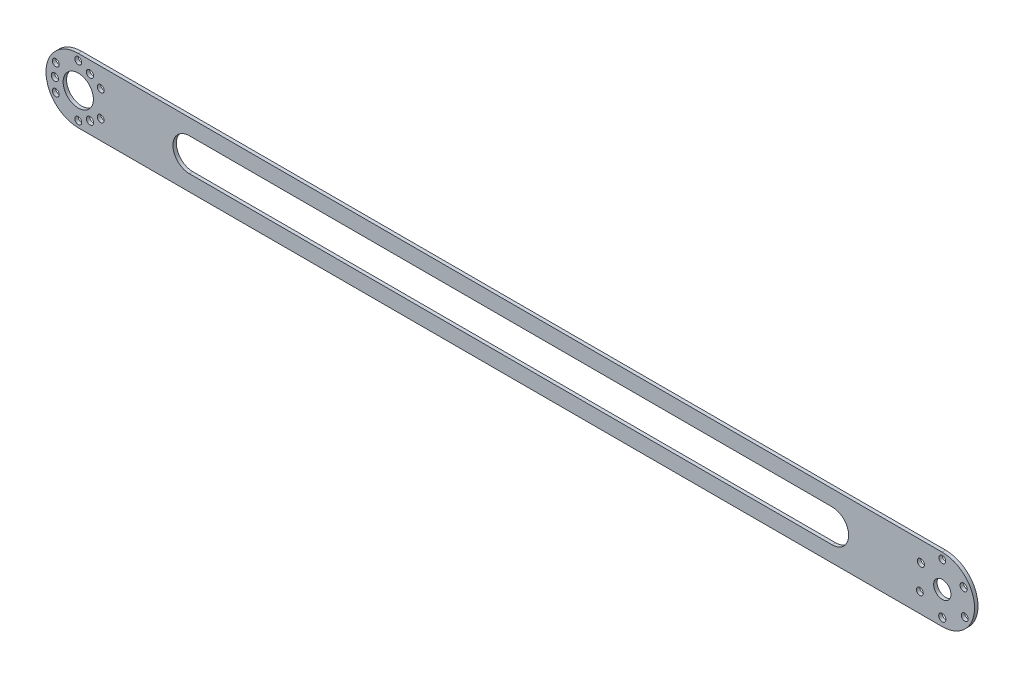
ISO-10303-21;
HEADER;
FILE_DESCRIPTION(('STEP AP214'),'2;1');
FILE_NAME('part.step','',(''),(''),'','','');
FILE_SCHEMA(('AUTOMOTIVE_DESIGN { 1 0 10303 214 1 1 1 1 }'));
ENDSEC;
DATA;
#1=APPLICATION_CONTEXT('core data for automotive mechanical design processes');
#2=APPLICATION_PROTOCOL_DEFINITION('international standard','automotive_design',2000,#1);
#3=PRODUCT_CONTEXT('',#1,'mechanical');
#4=PRODUCT('Part','Part','',(#3));
#5=PRODUCT_RELATED_PRODUCT_CATEGORY('part','',(#4));
#6=PRODUCT_DEFINITION_FORMATION('','',#4);
#7=PRODUCT_DEFINITION_CONTEXT('part definition',#1,'design');
#8=PRODUCT_DEFINITION('design','',#6,#7);
#9=PRODUCT_DEFINITION_SHAPE('','',#8);
#10=(LENGTH_UNIT() NAMED_UNIT(*) SI_UNIT(.MILLI.,.METRE.));
#11=(NAMED_UNIT(*) PLANE_ANGLE_UNIT() SI_UNIT($,.RADIAN.));
#12=(NAMED_UNIT(*) SI_UNIT($,.STERADIAN.) SOLID_ANGLE_UNIT());
#13=UNCERTAINTY_MEASURE_WITH_UNIT(LENGTH_MEASURE(1.E-05),#10,'distance_accuracy_value','');
#14=(GEOMETRIC_REPRESENTATION_CONTEXT(3) GLOBAL_UNCERTAINTY_ASSIGNED_CONTEXT((#13)) GLOBAL_UNIT_ASSIGNED_CONTEXT((#10,
#11,#12)) REPRESENTATION_CONTEXT('',''));
#15=CARTESIAN_POINT('',(0.,0.,0.));
#16=DIRECTION('',(0.,0.,1.));
#17=DIRECTION('',(1.,0.,0.));
#18=AXIS2_PLACEMENT_3D('',#15,#16,#17);
#19=CARTESIAN_POINT('',(341.797136251353,-84.9071474013098,2.));
#20=DIRECTION('',(0.,0.,-1.));
#21=DIRECTION('',(-1.,0.,0.));
#22=AXIS2_PLACEMENT_3D('',#19,#20,#21);
#23=PLANE('',#22);
#24=CARTESIAN_POINT('',(-150.85500660579,-96.6244711145133,2.));
#25=DIRECTION('',(0.,0.,1.));
#26=DIRECTION('',(1.,0.,0.));
#27=AXIS2_PLACEMENT_3D('',#24,#25,#26);
#28=CIRCLE('',#27,2.08);
#29=CARTESIAN_POINT('',(-148.77500660579,-96.6244711145133,2.));
#30=VERTEX_POINT('',#29);
#31=EDGE_CURVE('E153',#30,#30,#28,.T.);
#32=ORIENTED_EDGE('',*,*,#31,.F.);
#33=EDGE_LOOP('',(#32));
#34=FACE_BOUND('',#33,.T.);
#35=CARTESIAN_POINT('',(-150.85500660579,-73.1898236881064,2.));
#36=DIRECTION('',(0.,0.,1.));
#37=DIRECTION('',(1.,0.,0.));
#38=AXIS2_PLACEMENT_3D('',#35,#36,#37);
#39=CIRCLE('',#38,2.08000000000001);
#40=CARTESIAN_POINT('',(-148.77500660579,-73.1898236881064,2.));
#41=VERTEX_POINT('',#40);
#42=EDGE_CURVE('E161',#41,#41,#39,.T.);
#43=ORIENTED_EDGE('',*,*,#42,.F.);
#44=EDGE_LOOP('',(#43));
#45=FACE_BOUND('',#44,.T.);
#46=CARTESIAN_POINT('',(-157.62000660579,-84.9071474013098,2.));
#47=DIRECTION('',(0.,0.,1.));
#48=DIRECTION('',(1.,0.,0.));
#49=AXIS2_PLACEMENT_3D('',#46,#47,#48);
#50=CIRCLE('',#49,8.75);
#51=CARTESIAN_POINT('',(-148.87000660579,-84.9071474013098,2.));
#52=VERTEX_POINT('',#51);
#53=EDGE_CURVE('E169',#52,#52,#50,.T.);
#54=ORIENTED_EDGE('',*,*,#53,.F.);
#55=EDGE_LOOP('',(#54));
#56=FACE_BOUND('',#55,.T.);
#57=CARTESIAN_POINT('',(-144.629625549024,-92.40714740131,2.));
#58=DIRECTION('',(0.,0.,1.));
#59=DIRECTION('',(1.,0.,0.));
#60=AXIS2_PLACEMENT_3D('',#57,#58,#59);
#61=CIRCLE('',#60,1.99999999999999);
#62=CARTESIAN_POINT('',(-142.629625549024,-92.40714740131,2.));
#63=VERTEX_POINT('',#62);
#64=EDGE_CURVE('E177',#63,#63,#61,.T.);
#65=ORIENTED_EDGE('',*,*,#64,.F.);
#66=EDGE_LOOP('',(#65));
#67=FACE_BOUND('',#66,.T.);
#68=CARTESIAN_POINT('',(-144.629625549023,-77.40714740131,2.));
#69=DIRECTION('',(0.,0.,1.));
#70=DIRECTION('',(1.,0.,0.));
#71=AXIS2_PLACEMENT_3D('',#68,#69,#70);
#72=CIRCLE('',#71,1.99999999999999);
#73=CARTESIAN_POINT('',(-142.629625549024,-77.40714740131,2.));
#74=VERTEX_POINT('',#73);
#75=EDGE_CURVE('E185',#74,#74,#72,.T.);
#76=ORIENTED_EDGE('',*,*,#75,.F.);
#77=EDGE_LOOP('',(#76));
#78=FACE_BOUND('',#77,.T.);
#79=CARTESIAN_POINT('',(-157.62000660579,-69.9071474013098,2.));
#80=DIRECTION('',(0.,0.,1.));
#81=DIRECTION('',(1.,0.,0.));
#82=AXIS2_PLACEMENT_3D('',#79,#80,#81);
#83=CIRCLE('',#82,1.99999999999999);
#84=CARTESIAN_POINT('',(-155.62000660579,-69.9071474013098,2.));
#85=VERTEX_POINT('',#84);
#86=EDGE_CURVE('E193',#85,#85,#83,.T.);
#87=ORIENTED_EDGE('',*,*,#86,.F.);
#88=EDGE_LOOP('',(#87));
#89=FACE_BOUND('',#88,.T.);
#90=CARTESIAN_POINT('',(-170.610387662557,-77.4071474013098,2.));
#91=DIRECTION('',(0.,0.,1.));
#92=DIRECTION('',(1.,0.,0.));
#93=AXIS2_PLACEMENT_3D('',#90,#91,#92);
#94=CIRCLE('',#93,2.00000000000001);
#95=CARTESIAN_POINT('',(-168.610387662557,-77.4071474013098,2.));
#96=VERTEX_POINT('',#95);
#97=EDGE_CURVE('E201',#96,#96,#94,.T.);
#98=ORIENTED_EDGE('',*,*,#97,.F.);
#99=EDGE_LOOP('',(#98));
#100=FACE_BOUND('',#99,.T.);
#101=CARTESIAN_POINT('',(-170.610387662557,-92.4071474013098,2.));
#102=DIRECTION('',(0.,0.,1.));
#103=DIRECTION('',(1.,0.,0.));
#104=AXIS2_PLACEMENT_3D('',#101,#102,#103);
#105=CIRCLE('',#104,2.00000000000001);
#106=CARTESIAN_POINT('',(-168.610387662557,-92.4071474013098,2.));
#107=VERTEX_POINT('',#106);
#108=EDGE_CURVE('E209',#107,#107,#105,.T.);
#109=ORIENTED_EDGE('',*,*,#108,.F.);
#110=EDGE_LOOP('',(#109));
#111=FACE_BOUND('',#110,.T.);
#112=CARTESIAN_POINT('',(-171.15000660579,-84.9071474013098,2.));
#113=DIRECTION('',(0.,0.,1.));
#114=DIRECTION('',(1.,0.,0.));
#115=AXIS2_PLACEMENT_3D('',#112,#113,#114);
#116=CIRCLE('',#115,2.08);
#117=CARTESIAN_POINT('',(-169.07000660579,-84.9071474013098,2.));
#118=VERTEX_POINT('',#117);
#119=EDGE_CURVE('E217',#118,#118,#116,.T.);
#120=ORIENTED_EDGE('',*,*,#119,.F.);
#121=EDGE_LOOP('',(#120));
#122=FACE_BOUND('',#121,.T.);
#123=CARTESIAN_POINT('',(-157.62000660579,-99.9071474013098,2.));
#124=DIRECTION('',(0.,0.,1.));
#125=DIRECTION('',(1.,0.,0.));
#126=AXIS2_PLACEMENT_3D('',#123,#124,#125);
#127=CIRCLE('',#126,2.);
#128=CARTESIAN_POINT('',(-155.62000660579,-99.9071474013098,2.));
#129=VERTEX_POINT('',#128);
#130=EDGE_CURVE('E225',#129,#129,#127,.T.);
#131=ORIENTED_EDGE('',*,*,#130,.F.);
#132=EDGE_LOOP('',(#131));
#133=FACE_BOUND('',#132,.T.);
#134=CARTESIAN_POINT('',(341.797136251355,-99.0365196042188,2.));
#135=DIRECTION('',(0.,0.,1.));
#136=DIRECTION('',(1.,0.,0.));
#137=AXIS2_PLACEMENT_3D('',#134,#135,#136);
#138=CIRCLE('',#137,2.08000000000043);
#139=CARTESIAN_POINT('',(343.877136251355,-99.0365196042188,2.));
#140=VERTEX_POINT('',#139);
#141=EDGE_CURVE('E233',#140,#140,#138,.T.);
#142=ORIENTED_EDGE('',*,*,#141,.F.);
#143=EDGE_LOOP('',(#142));
#144=FACE_BOUND('',#143,.T.);
#145=CARTESIAN_POINT('',(354.159723791721,-77.6238898712818,2.));
#146=DIRECTION('',(0.,0.,1.));
#147=DIRECTION('',(1.,0.,0.));
#148=AXIS2_PLACEMENT_3D('',#145,#146,#147);
#149=CIRCLE('',#148,2.08000000000107);
#150=CARTESIAN_POINT('',(356.239723791722,-77.6238898712818,2.));
#151=VERTEX_POINT('',#150);
#152=EDGE_CURVE('E241',#151,#151,#149,.T.);
#153=ORIENTED_EDGE('',*,*,#152,.F.);
#154=EDGE_LOOP('',(#153));
#155=FACE_BOUND('',#154,.T.);
#156=CARTESIAN_POINT('',(329.434548710984,-77.7696041569979,2.));
#157=DIRECTION('',(0.,0.,1.));
#158=DIRECTION('',(1.,0.,0.));
#159=AXIS2_PLACEMENT_3D('',#156,#157,#158);
#160=CIRCLE('',#159,2.07999999999938);
#161=CARTESIAN_POINT('',(331.514548710984,-77.7696041569979,2.));
#162=VERTEX_POINT('',#161);
#163=EDGE_CURVE('E249',#162,#162,#160,.T.);
#164=ORIENTED_EDGE('',*,*,#163,.F.);
#165=EDGE_LOOP('',(#164));
#166=FACE_BOUND('',#165,.T.);
#167=CARTESIAN_POINT('',(328.806755194587,-92.4071474013096,2.));
#168=DIRECTION('',(0.,0.,1.));
#169=DIRECTION('',(1.,0.,0.));
#170=AXIS2_PLACEMENT_3D('',#167,#168,#169);
#171=CIRCLE('',#170,2.0000000000004);
#172=CARTESIAN_POINT('',(330.806755194587,-92.4071474013096,2.));
#173=VERTEX_POINT('',#172);
#174=EDGE_CURVE('E257',#173,#173,#171,.T.);
#175=ORIENTED_EDGE('',*,*,#174,.F.);
#176=EDGE_LOOP('',(#175));
#177=FACE_BOUND('',#176,.T.);
#178=CARTESIAN_POINT('',(354.78751730812,-92.261433115595,2.));
#179=DIRECTION('',(0.,0.,1.));
#180=DIRECTION('',(1.,0.,0.));
#181=AXIS2_PLACEMENT_3D('',#178,#179,#180);
#182=CIRCLE('',#181,2.00000000000081);
#183=CARTESIAN_POINT('',(356.787517308121,-92.261433115595,2.));
#184=VERTEX_POINT('',#183);
#185=EDGE_CURVE('E265',#184,#184,#182,.T.);
#186=ORIENTED_EDGE('',*,*,#185,.F.);
#187=EDGE_LOOP('',(#186));
#188=FACE_BOUND('',#187,.T.);
#189=CARTESIAN_POINT('',(341.797136251353,-69.9071474013097,2.));
#190=DIRECTION('',(0.,0.,1.));
#191=DIRECTION('',(1.,0.,0.));
#192=AXIS2_PLACEMENT_3D('',#189,#190,#191);
#193=CIRCLE('',#192,2.);
#194=CARTESIAN_POINT('',(343.797136251353,-69.9071474013097,2.));
#195=VERTEX_POINT('',#194);
#196=EDGE_CURVE('E273',#195,#195,#193,.T.);
#197=ORIENTED_EDGE('',*,*,#196,.F.);
#198=EDGE_LOOP('',(#197));
#199=FACE_BOUND('',#198,.T.);
#200=CARTESIAN_POINT('',(341.797136251353,-84.9071474013098,2.));
#201=DIRECTION('',(0.,0.,1.));
#202=DIRECTION('',(1.,0.,0.));
#203=AXIS2_PLACEMENT_3D('',#200,#201,#202);
#204=CIRCLE('',#203,4.99999999999999);
#205=CARTESIAN_POINT('',(346.797136251353,-84.9071474013098,2.));
#206=VERTEX_POINT('',#205);
#207=EDGE_CURVE('E281',#206,#206,#204,.T.);
#208=ORIENTED_EDGE('',*,*,#207,.F.);
#209=EDGE_LOOP('',(#208));
#210=FACE_BOUND('',#209,.T.);
#211=CARTESIAN_POINT('',(341.797136251353,-84.9071474013098,2.));
#212=DIRECTION('',(0.,0.,1.));
#213=DIRECTION('',(-1.,0.,0.));
#214=AXIS2_PLACEMENT_3D('',#211,#212,#213);
#215=CIRCLE('',#214,18.6457142857142);
#216=CARTESIAN_POINT('',(341.797136251353,-103.552861687024,2.));
#217=VERTEX_POINT('',#216);
#218=CARTESIAN_POINT('',(341.797136251353,-66.2614331155955,2.));
#219=VERTEX_POINT('',#218);
#220=EDGE_CURVE('E289',#217,#219,#215,.T.);
#221=ORIENTED_EDGE('',*,*,#220,.T.);
#222=DIRECTION('',(-1.,0.,0.));
#223=VECTOR('',#222,1.);
#224=CARTESIAN_POINT('',(341.797136251353,-66.2614331155955,2.));
#225=LINE('',#224,#223);
#226=CARTESIAN_POINT('',(-157.62000660579,-66.2614331155956,2.));
#227=VERTEX_POINT('',#226);
#228=EDGE_CURVE('E293',#219,#227,#225,.T.);
#229=ORIENTED_EDGE('',*,*,#228,.T.);
#230=CARTESIAN_POINT('',(-157.62000660579,-84.9071474013098,2.));
#231=DIRECTION('',(0.,0.,1.));
#232=DIRECTION('',(-1.,0.,0.));
#233=AXIS2_PLACEMENT_3D('',#230,#231,#232);
#234=CIRCLE('',#233,18.6457142857142);
#235=CARTESIAN_POINT('',(-157.62000660579,-103.552861687024,2.));
#236=VERTEX_POINT('',#235);
#237=EDGE_CURVE('E297',#227,#236,#234,.T.);
#238=ORIENTED_EDGE('',*,*,#237,.T.);
#239=DIRECTION('',(1.,0.,0.));
#240=VECTOR('',#239,1.);
#241=CARTESIAN_POINT('',(-157.62000660579,-103.552861687024,2.));
#242=LINE('',#241,#240);
#243=EDGE_CURVE('E300',#236,#217,#242,.T.);
#244=ORIENTED_EDGE('',*,*,#243,.T.);
#245=EDGE_LOOP('',(#221,#229,#238,#244));
#246=FACE_BOUND('',#245,.T.);
#247=CARTESIAN_POINT('',(-93.4219624882659,-84.9071474013098,2.));
#248=DIRECTION('',(0.,0.,1.));
#249=DIRECTION('',(1.,0.,0.));
#250=AXIS2_PLACEMENT_3D('',#247,#248,#249);
#251=CIRCLE('',#250,9.48310201444286);
#252=CARTESIAN_POINT('',(-93.4219624882659,-75.424045386867,2.));
#253=VERTEX_POINT('',#252);
#254=CARTESIAN_POINT('',(-93.4219624882659,-94.3902494157527,2.));
#255=VERTEX_POINT('',#254);
#256=EDGE_CURVE('E105',#253,#255,#251,.T.);
#257=ORIENTED_EDGE('',*,*,#256,.F.);
#258=DIRECTION('',(-1.,0.,0.));
#259=VECTOR('',#258,1.);
#260=CARTESIAN_POINT('',(-93.4219624882659,-75.424045386867,2.));
#261=LINE('',#260,#259);
#262=CARTESIAN_POINT('',(278.181949276686,-75.424045386867,2.));
#263=VERTEX_POINT('',#262);
#264=EDGE_CURVE('E131',#263,#253,#261,.T.);
#265=ORIENTED_EDGE('',*,*,#264,.F.);
#266=CARTESIAN_POINT('',(278.181949276686,-84.9071474013098,2.));
#267=DIRECTION('',(0.,0.,1.));
#268=DIRECTION('',(1.,0.,0.));
#269=AXIS2_PLACEMENT_3D('',#266,#267,#268);
#270=CIRCLE('',#269,9.48310201444286);
#271=CARTESIAN_POINT('',(278.181949276686,-94.3902494157527,2.));
#272=VERTEX_POINT('',#271);
#273=EDGE_CURVE('E127',#272,#263,#270,.T.);
#274=ORIENTED_EDGE('',*,*,#273,.F.);
#275=DIRECTION('',(1.,0.,0.));
#276=VECTOR('',#275,1.);
#277=CARTESIAN_POINT('',(-93.4219624882659,-94.3902494157527,2.));
#278=LINE('',#277,#276);
#279=EDGE_CURVE('E114',#255,#272,#278,.T.);
#280=ORIENTED_EDGE('',*,*,#279,.F.);
#281=EDGE_LOOP('',(#257,#265,#274,#280));
#282=FACE_BOUND('',#281,.T.);
#283=ADVANCED_FACE('F39',(#34,#45,#56,#67,#78,#89,#100,#111,#122,#133,#144,#155,#166,#177,#188,
#199,#210,#246,#282),#23,.F.);
#284=CARTESIAN_POINT('',(341.797136251353,-84.9071474013098,0.));
#285=DIRECTION('',(0.,0.,-1.));
#286=DIRECTION('',(-1.,0.,0.));
#287=AXIS2_PLACEMENT_3D('',#284,#285,#286);
#288=PLANE('',#287);
#289=CARTESIAN_POINT('',(-150.85500660579,-73.1898236881064,0.));
#290=DIRECTION('',(0.,0.,1.));
#291=DIRECTION('',(1.,0.,0.));
#292=AXIS2_PLACEMENT_3D('',#289,#290,#291);
#293=CIRCLE('',#292,2.08000000000001);
#294=CARTESIAN_POINT('',(-148.77500660579,-73.1898236881064,0.));
#295=VERTEX_POINT('',#294);
#296=EDGE_CURVE('E157',#295,#295,#293,.T.);
#297=ORIENTED_EDGE('',*,*,#296,.T.);
#298=EDGE_LOOP('',(#297));
#299=FACE_BOUND('',#298,.T.);
#300=CARTESIAN_POINT('',(-144.629625549024,-92.40714740131,0.));
#301=DIRECTION('',(0.,0.,1.));
#302=DIRECTION('',(1.,0.,0.));
#303=AXIS2_PLACEMENT_3D('',#300,#301,#302);
#304=CIRCLE('',#303,1.99999999999999);
#305=CARTESIAN_POINT('',(-142.629625549024,-92.40714740131,0.));
#306=VERTEX_POINT('',#305);
#307=EDGE_CURVE('E173',#306,#306,#304,.T.);
#308=ORIENTED_EDGE('',*,*,#307,.T.);
#309=EDGE_LOOP('',(#308));
#310=FACE_BOUND('',#309,.T.);
#311=CARTESIAN_POINT('',(-157.62000660579,-69.9071474013098,0.));
#312=DIRECTION('',(0.,0.,1.));
#313=DIRECTION('',(1.,0.,0.));
#314=AXIS2_PLACEMENT_3D('',#311,#312,#313);
#315=CIRCLE('',#314,1.99999999999999);
#316=CARTESIAN_POINT('',(-155.62000660579,-69.9071474013098,0.));
#317=VERTEX_POINT('',#316);
#318=EDGE_CURVE('E189',#317,#317,#315,.T.);
#319=ORIENTED_EDGE('',*,*,#318,.T.);
#320=EDGE_LOOP('',(#319));
#321=FACE_BOUND('',#320,.T.);
#322=CARTESIAN_POINT('',(-170.610387662557,-92.4071474013098,0.));
#323=DIRECTION('',(0.,0.,1.));
#324=DIRECTION('',(1.,0.,0.));
#325=AXIS2_PLACEMENT_3D('',#322,#323,#324);
#326=CIRCLE('',#325,2.00000000000001);
#327=CARTESIAN_POINT('',(-168.610387662557,-92.4071474013098,0.));
#328=VERTEX_POINT('',#327);
#329=EDGE_CURVE('E205',#328,#328,#326,.T.);
#330=ORIENTED_EDGE('',*,*,#329,.T.);
#331=EDGE_LOOP('',(#330));
#332=FACE_BOUND('',#331,.T.);
#333=CARTESIAN_POINT('',(-157.62000660579,-99.9071474013098,0.));
#334=DIRECTION('',(0.,0.,1.));
#335=DIRECTION('',(1.,0.,0.));
#336=AXIS2_PLACEMENT_3D('',#333,#334,#335);
#337=CIRCLE('',#336,2.);
#338=CARTESIAN_POINT('',(-155.62000660579,-99.9071474013098,0.));
#339=VERTEX_POINT('',#338);
#340=EDGE_CURVE('E221',#339,#339,#337,.T.);
#341=ORIENTED_EDGE('',*,*,#340,.T.);
#342=EDGE_LOOP('',(#341));
#343=FACE_BOUND('',#342,.T.);
#344=CARTESIAN_POINT('',(354.159723791721,-77.6238898712818,0.));
#345=DIRECTION('',(0.,0.,1.));
#346=DIRECTION('',(1.,0.,0.));
#347=AXIS2_PLACEMENT_3D('',#344,#345,#346);
#348=CIRCLE('',#347,2.08000000000107);
#349=CARTESIAN_POINT('',(356.239723791722,-77.6238898712818,0.));
#350=VERTEX_POINT('',#349);
#351=EDGE_CURVE('E237',#350,#350,#348,.T.);
#352=ORIENTED_EDGE('',*,*,#351,.T.);
#353=EDGE_LOOP('',(#352));
#354=FACE_BOUND('',#353,.T.);
#355=CARTESIAN_POINT('',(328.806755194587,-92.4071474013096,0.));
#356=DIRECTION('',(0.,0.,1.));
#357=DIRECTION('',(1.,0.,0.));
#358=AXIS2_PLACEMENT_3D('',#355,#356,#357);
#359=CIRCLE('',#358,2.0000000000004);
#360=CARTESIAN_POINT('',(330.806755194587,-92.4071474013096,0.));
#361=VERTEX_POINT('',#360);
#362=EDGE_CURVE('E253',#361,#361,#359,.T.);
#363=ORIENTED_EDGE('',*,*,#362,.T.);
#364=EDGE_LOOP('',(#363));
#365=FACE_BOUND('',#364,.T.);
#366=CARTESIAN_POINT('',(341.797136251353,-69.9071474013097,0.));
#367=DIRECTION('',(0.,0.,1.));
#368=DIRECTION('',(1.,0.,0.));
#369=AXIS2_PLACEMENT_3D('',#366,#367,#368);
#370=CIRCLE('',#369,2.);
#371=CARTESIAN_POINT('',(343.797136251353,-69.9071474013097,0.));
#372=VERTEX_POINT('',#371);
#373=EDGE_CURVE('E269',#372,#372,#370,.T.);
#374=ORIENTED_EDGE('',*,*,#373,.T.);
#375=EDGE_LOOP('',(#374));
#376=FACE_BOUND('',#375,.T.);
#377=CARTESIAN_POINT('',(341.797136251353,-84.9071474013098,0.));
#378=DIRECTION('',(0.,0.,1.));
#379=DIRECTION('',(-1.,0.,0.));
#380=AXIS2_PLACEMENT_3D('',#377,#378,#379);
#381=CIRCLE('',#380,18.6457142857142);
#382=CARTESIAN_POINT('',(341.797136251353,-103.552861687024,0.));
#383=VERTEX_POINT('',#382);
#384=CARTESIAN_POINT('',(341.797136251353,-66.2614331155955,0.));
#385=VERTEX_POINT('',#384);
#386=EDGE_CURVE('E285',#383,#385,#381,.T.);
#387=ORIENTED_EDGE('',*,*,#386,.F.);
#388=DIRECTION('',(1.,0.,0.));
#389=VECTOR('',#388,1.);
#390=CARTESIAN_POINT('',(-157.62000660579,-103.552861687024,0.));
#391=LINE('',#390,#389);
#392=CARTESIAN_POINT('',(-157.62000660579,-103.552861687024,0.));
#393=VERTEX_POINT('',#392);
#394=EDGE_CURVE('E294',#393,#383,#391,.T.);
#395=ORIENTED_EDGE('',*,*,#394,.F.);
#396=CARTESIAN_POINT('',(-157.62000660579,-84.9071474013098,0.));
#397=DIRECTION('',(0.,0.,1.));
#398=DIRECTION('',(-1.,0.,0.));
#399=AXIS2_PLACEMENT_3D('',#396,#397,#398);
#400=CIRCLE('',#399,18.6457142857142);
#401=CARTESIAN_POINT('',(-157.62000660579,-66.2614331155956,0.));
#402=VERTEX_POINT('',#401);
#403=EDGE_CURVE('E310',#402,#393,#400,.T.);
#404=ORIENTED_EDGE('',*,*,#403,.F.);
#405=DIRECTION('',(-1.,0.,0.));
#406=VECTOR('',#405,1.);
#407=CARTESIAN_POINT('',(341.797136251353,-66.2614331155955,0.));
#408=LINE('',#407,#406);
#409=EDGE_CURVE('E307',#385,#402,#408,.T.);
#410=ORIENTED_EDGE('',*,*,#409,.F.);
#411=EDGE_LOOP('',(#387,#395,#404,#410));
#412=FACE_BOUND('',#411,.T.);
#413=CARTESIAN_POINT('',(341.797136251353,-84.9071474013098,0.));
#414=DIRECTION('',(0.,0.,1.));
#415=DIRECTION('',(1.,0.,0.));
#416=AXIS2_PLACEMENT_3D('',#413,#414,#415);
#417=CIRCLE('',#416,4.99999999999999);
#418=CARTESIAN_POINT('',(346.797136251353,-84.9071474013098,0.));
#419=VERTEX_POINT('',#418);
#420=EDGE_CURVE('E277',#419,#419,#417,.T.);
#421=ORIENTED_EDGE('',*,*,#420,.T.);
#422=EDGE_LOOP('',(#421));
#423=FACE_BOUND('',#422,.T.);
#424=CARTESIAN_POINT('',(354.78751730812,-92.261433115595,0.));
#425=DIRECTION('',(0.,0.,1.));
#426=DIRECTION('',(1.,0.,0.));
#427=AXIS2_PLACEMENT_3D('',#424,#425,#426);
#428=CIRCLE('',#427,2.00000000000081);
#429=CARTESIAN_POINT('',(356.787517308121,-92.261433115595,0.));
#430=VERTEX_POINT('',#429);
#431=EDGE_CURVE('E261',#430,#430,#428,.T.);
#432=ORIENTED_EDGE('',*,*,#431,.T.);
#433=EDGE_LOOP('',(#432));
#434=FACE_BOUND('',#433,.T.);
#435=CARTESIAN_POINT('',(329.434548710984,-77.7696041569979,0.));
#436=DIRECTION('',(0.,0.,1.));
#437=DIRECTION('',(1.,0.,0.));
#438=AXIS2_PLACEMENT_3D('',#435,#436,#437);
#439=CIRCLE('',#438,2.07999999999938);
#440=CARTESIAN_POINT('',(331.514548710984,-77.7696041569979,0.));
#441=VERTEX_POINT('',#440);
#442=EDGE_CURVE('E245',#441,#441,#439,.T.);
#443=ORIENTED_EDGE('',*,*,#442,.T.);
#444=EDGE_LOOP('',(#443));
#445=FACE_BOUND('',#444,.T.);
#446=CARTESIAN_POINT('',(341.797136251355,-99.0365196042188,0.));
#447=DIRECTION('',(0.,0.,1.));
#448=DIRECTION('',(1.,0.,0.));
#449=AXIS2_PLACEMENT_3D('',#446,#447,#448);
#450=CIRCLE('',#449,2.08000000000043);
#451=CARTESIAN_POINT('',(343.877136251355,-99.0365196042188,0.));
#452=VERTEX_POINT('',#451);
#453=EDGE_CURVE('E229',#452,#452,#450,.T.);
#454=ORIENTED_EDGE('',*,*,#453,.T.);
#455=EDGE_LOOP('',(#454));
#456=FACE_BOUND('',#455,.T.);
#457=CARTESIAN_POINT('',(-171.15000660579,-84.9071474013098,0.));
#458=DIRECTION('',(0.,0.,1.));
#459=DIRECTION('',(1.,0.,0.));
#460=AXIS2_PLACEMENT_3D('',#457,#458,#459);
#461=CIRCLE('',#460,2.08);
#462=CARTESIAN_POINT('',(-169.07000660579,-84.9071474013098,0.));
#463=VERTEX_POINT('',#462);
#464=EDGE_CURVE('E213',#463,#463,#461,.T.);
#465=ORIENTED_EDGE('',*,*,#464,.T.);
#466=EDGE_LOOP('',(#465));
#467=FACE_BOUND('',#466,.T.);
#468=CARTESIAN_POINT('',(-170.610387662557,-77.4071474013098,0.));
#469=DIRECTION('',(0.,0.,1.));
#470=DIRECTION('',(1.,0.,0.));
#471=AXIS2_PLACEMENT_3D('',#468,#469,#470);
#472=CIRCLE('',#471,2.00000000000001);
#473=CARTESIAN_POINT('',(-168.610387662557,-77.4071474013098,0.));
#474=VERTEX_POINT('',#473);
#475=EDGE_CURVE('E197',#474,#474,#472,.T.);
#476=ORIENTED_EDGE('',*,*,#475,.T.);
#477=EDGE_LOOP('',(#476));
#478=FACE_BOUND('',#477,.T.);
#479=CARTESIAN_POINT('',(-144.629625549023,-77.40714740131,0.));
#480=DIRECTION('',(0.,0.,1.));
#481=DIRECTION('',(1.,0.,0.));
#482=AXIS2_PLACEMENT_3D('',#479,#480,#481);
#483=CIRCLE('',#482,1.99999999999999);
#484=CARTESIAN_POINT('',(-142.629625549024,-77.40714740131,0.));
#485=VERTEX_POINT('',#484);
#486=EDGE_CURVE('E181',#485,#485,#483,.T.);
#487=ORIENTED_EDGE('',*,*,#486,.T.);
#488=EDGE_LOOP('',(#487));
#489=FACE_BOUND('',#488,.T.);
#490=CARTESIAN_POINT('',(-157.62000660579,-84.9071474013098,0.));
#491=DIRECTION('',(0.,0.,1.));
#492=DIRECTION('',(1.,0.,0.));
#493=AXIS2_PLACEMENT_3D('',#490,#491,#492);
#494=CIRCLE('',#493,8.75);
#495=CARTESIAN_POINT('',(-148.87000660579,-84.9071474013098,0.));
#496=VERTEX_POINT('',#495);
#497=EDGE_CURVE('E165',#496,#496,#494,.T.);
#498=ORIENTED_EDGE('',*,*,#497,.T.);
#499=EDGE_LOOP('',(#498));
#500=FACE_BOUND('',#499,.T.);
#501=CARTESIAN_POINT('',(-150.85500660579,-96.6244711145133,0.));
#502=DIRECTION('',(0.,0.,1.));
#503=DIRECTION('',(1.,0.,0.));
#504=AXIS2_PLACEMENT_3D('',#501,#502,#503);
#505=CIRCLE('',#504,2.08);
#506=CARTESIAN_POINT('',(-148.77500660579,-96.6244711145133,0.));
#507=VERTEX_POINT('',#506);
#508=EDGE_CURVE('E123',#507,#507,#505,.T.);
#509=ORIENTED_EDGE('',*,*,#508,.T.);
#510=EDGE_LOOP('',(#509));
#511=FACE_BOUND('',#510,.T.);
#512=DIRECTION('',(-1.,0.,0.));
#513=VECTOR('',#512,1.);
#514=CARTESIAN_POINT('',(-93.4219624882659,-75.424045386867,0.));
#515=LINE('',#514,#513);
#516=CARTESIAN_POINT('',(278.181949276686,-75.424045386867,0.));
#517=VERTEX_POINT('',#516);
#518=CARTESIAN_POINT('',(-93.4219624882659,-75.424045386867,0.));
#519=VERTEX_POINT('',#518);
#520=EDGE_CURVE('E115',#517,#519,#515,.T.);
#521=ORIENTED_EDGE('',*,*,#520,.T.);
#522=CARTESIAN_POINT('',(-93.4219624882659,-84.9071474013098,0.));
#523=DIRECTION('',(0.,0.,1.));
#524=DIRECTION('',(1.,0.,0.));
#525=AXIS2_PLACEMENT_3D('',#522,#523,#524);
#526=CIRCLE('',#525,9.48310201444286);
#527=CARTESIAN_POINT('',(-93.4219624882659,-94.3902494157527,0.));
#528=VERTEX_POINT('',#527);
#529=EDGE_CURVE('E63',#519,#528,#526,.T.);
#530=ORIENTED_EDGE('',*,*,#529,.T.);
#531=DIRECTION('',(1.,0.,0.));
#532=VECTOR('',#531,1.);
#533=CARTESIAN_POINT('',(-93.4219624882659,-94.3902494157527,0.));
#534=LINE('',#533,#532);
#535=CARTESIAN_POINT('',(278.181949276686,-94.3902494157527,0.));
#536=VERTEX_POINT('',#535);
#537=EDGE_CURVE('E121',#528,#536,#534,.T.);
#538=ORIENTED_EDGE('',*,*,#537,.T.);
#539=CARTESIAN_POINT('',(278.181949276686,-84.9071474013098,0.));
#540=DIRECTION('',(0.,0.,1.));
#541=DIRECTION('',(1.,0.,0.));
#542=AXIS2_PLACEMENT_3D('',#539,#540,#541);
#543=CIRCLE('',#542,9.48310201444286);
#544=EDGE_CURVE('E140',#536,#517,#543,.T.);
#545=ORIENTED_EDGE('',*,*,#544,.T.);
#546=EDGE_LOOP('',(#521,#530,#538,#545));
#547=FACE_BOUND('',#546,.T.);
#548=ADVANCED_FACE('F333',(#299,#310,#321,#332,#343,#354,#365,#376,#412,#423,#434,#445,#456,
#467,#478,#489,#500,#511,#547),#288,.T.);
#549=CARTESIAN_POINT('',(341.797136251353,-84.9071474013098,2.));
#550=DIRECTION('',(0.,0.,-1.));
#551=DIRECTION('',(-1.,0.,0.));
#552=AXIS2_PLACEMENT_3D('',#549,#550,#551);
#553=CYLINDRICAL_SURFACE('',#552,18.6457142857142);
#554=ORIENTED_EDGE('',*,*,#386,.T.);
#555=DIRECTION('',(0.,0.,-1.));
#556=VECTOR('',#555,1.);
#557=CARTESIAN_POINT('',(341.797136251353,-66.2614331155955,2.));
#558=LINE('',#557,#556);
#559=EDGE_CURVE('E11',#219,#385,#558,.T.);
#560=ORIENTED_EDGE('',*,*,#559,.F.);
#561=ORIENTED_EDGE('',*,*,#220,.F.);
#562=DIRECTION('',(0.,0.,-1.));
#563=VECTOR('',#562,1.);
#564=CARTESIAN_POINT('',(341.797136251353,-103.552861687024,2.));
#565=LINE('',#564,#563);
#566=EDGE_CURVE('E303',#217,#383,#565,.T.);
#567=ORIENTED_EDGE('',*,*,#566,.T.);
#568=EDGE_LOOP('',(#554,#560,#561,#567));
#569=FACE_BOUND('',#568,.T.);
#570=ADVANCED_FACE('F41',(#569),#553,.T.);
#571=CARTESIAN_POINT('',(341.797136251353,-66.2614331155955,2.));
#572=DIRECTION('',(0.,-1.,0.));
#573=DIRECTION('',(1.,0.,0.));
#574=AXIS2_PLACEMENT_3D('',#571,#572,#573);
#575=PLANE('',#574);
#576=ORIENTED_EDGE('',*,*,#409,.T.);
#577=DIRECTION('',(0.,0.,-1.));
#578=VECTOR('',#577,1.);
#579=CARTESIAN_POINT('',(-157.62000660579,-66.2614331155956,2.));
#580=LINE('',#579,#578);
#581=EDGE_CURVE('E48',#227,#402,#580,.T.);
#582=ORIENTED_EDGE('',*,*,#581,.F.);
#583=ORIENTED_EDGE('',*,*,#228,.F.);
#584=ORIENTED_EDGE('',*,*,#559,.T.);
#585=EDGE_LOOP('',(#576,#582,#583,#584));
#586=FACE_BOUND('',#585,.T.);
#587=ADVANCED_FACE('F343',(#586),#575,.F.);
#588=CARTESIAN_POINT('',(-157.62000660579,-84.9071474013098,2.));
#589=DIRECTION('',(0.,0.,-1.));
#590=DIRECTION('',(-1.,0.,0.));
#591=AXIS2_PLACEMENT_3D('',#588,#589,#590);
#592=CYLINDRICAL_SURFACE('',#591,18.6457142857142);
#593=ORIENTED_EDGE('',*,*,#403,.T.);
#594=DIRECTION('',(0.,0.,-1.));
#595=VECTOR('',#594,1.);
#596=CARTESIAN_POINT('',(-157.62000660579,-103.552861687024,2.));
#597=LINE('',#596,#595);
#598=EDGE_CURVE('E318',#236,#393,#597,.T.);
#599=ORIENTED_EDGE('',*,*,#598,.F.);
#600=ORIENTED_EDGE('',*,*,#237,.F.);
#601=ORIENTED_EDGE('',*,*,#581,.T.);
#602=EDGE_LOOP('',(#593,#599,#600,#601));
#603=FACE_BOUND('',#602,.T.);
#604=ADVANCED_FACE('F327',(#603),#592,.T.);
#605=CARTESIAN_POINT('',(-157.62000660579,-103.552861687024,2.));
#606=DIRECTION('',(0.,1.,0.));
#607=DIRECTION('',(-1.,0.,0.));
#608=AXIS2_PLACEMENT_3D('',#605,#606,#607);
#609=PLANE('',#608);
#610=ORIENTED_EDGE('',*,*,#394,.T.);
#611=ORIENTED_EDGE('',*,*,#566,.F.);
#612=ORIENTED_EDGE('',*,*,#243,.F.);
#613=ORIENTED_EDGE('',*,*,#598,.T.);
#614=EDGE_LOOP('',(#610,#611,#612,#613));
#615=FACE_BOUND('',#614,.T.);
#616=ADVANCED_FACE('F337',(#615),#609,.F.);
#617=CARTESIAN_POINT('',(341.797136251353,-84.9071474013098,2.));
#618=DIRECTION('',(0.,0.,-1.));
#619=DIRECTION('',(-1.,0.,0.));
#620=AXIS2_PLACEMENT_3D('',#617,#618,#619);
#621=CYLINDRICAL_SURFACE('',#620,4.99999999999999);
#622=ORIENTED_EDGE('',*,*,#207,.T.);
#623=EDGE_LOOP('',(#622));
#624=FACE_BOUND('',#623,.T.);
#625=ORIENTED_EDGE('',*,*,#420,.F.);
#626=EDGE_LOOP('',(#625));
#627=FACE_BOUND('',#626,.T.);
#628=ADVANCED_FACE('F361',(#624,#627),#621,.F.);
#629=CARTESIAN_POINT('',(341.797136251353,-69.9071474013097,2.));
#630=DIRECTION('',(0.,0.,-1.));
#631=DIRECTION('',(-1.,0.,0.));
#632=AXIS2_PLACEMENT_3D('',#629,#630,#631);
#633=CYLINDRICAL_SURFACE('',#632,2.);
#634=ORIENTED_EDGE('',*,*,#196,.T.);
#635=EDGE_LOOP('',(#634));
#636=FACE_BOUND('',#635,.T.);
#637=ORIENTED_EDGE('',*,*,#373,.F.);
#638=EDGE_LOOP('',(#637));
#639=FACE_BOUND('',#638,.T.);
#640=ADVANCED_FACE('F368',(#636,#639),#633,.F.);
#641=CARTESIAN_POINT('',(354.78751730812,-92.261433115595,2.));
#642=DIRECTION('',(0.,0.,-1.));
#643=DIRECTION('',(-1.,0.,0.));
#644=AXIS2_PLACEMENT_3D('',#641,#642,#643);
#645=CYLINDRICAL_SURFACE('',#644,2.00000000000081);
#646=ORIENTED_EDGE('',*,*,#185,.T.);
#647=EDGE_LOOP('',(#646));
#648=FACE_BOUND('',#647,.T.);
#649=ORIENTED_EDGE('',*,*,#431,.F.);
#650=EDGE_LOOP('',(#649));
#651=FACE_BOUND('',#650,.T.);
#652=ADVANCED_FACE('F373',(#648,#651),#645,.F.);
#653=CARTESIAN_POINT('',(328.806755194587,-92.4071474013096,2.));
#654=DIRECTION('',(0.,0.,-1.));
#655=DIRECTION('',(-1.,0.,0.));
#656=AXIS2_PLACEMENT_3D('',#653,#654,#655);
#657=CYLINDRICAL_SURFACE('',#656,2.0000000000004);
#658=ORIENTED_EDGE('',*,*,#174,.T.);
#659=EDGE_LOOP('',(#658));
#660=FACE_BOUND('',#659,.T.);
#661=ORIENTED_EDGE('',*,*,#362,.F.);
#662=EDGE_LOOP('',(#661));
#663=FACE_BOUND('',#662,.T.);
#664=ADVANCED_FACE('F461',(#660,#663),#657,.F.);
#665=CARTESIAN_POINT('',(329.434548710984,-77.7696041569979,2.));
#666=DIRECTION('',(0.,0.,-1.));
#667=DIRECTION('',(-1.,0.,0.));
#668=AXIS2_PLACEMENT_3D('',#665,#666,#667);
#669=CYLINDRICAL_SURFACE('',#668,2.07999999999938);
#670=ORIENTED_EDGE('',*,*,#163,.T.);
#671=EDGE_LOOP('',(#670));
#672=FACE_BOUND('',#671,.T.);
#673=ORIENTED_EDGE('',*,*,#442,.F.);
#674=EDGE_LOOP('',(#673));
#675=FACE_BOUND('',#674,.T.);
#676=ADVANCED_FACE('F457',(#672,#675),#669,.F.);
#677=CARTESIAN_POINT('',(354.159723791721,-77.6238898712818,2.));
#678=DIRECTION('',(0.,0.,-1.));
#679=DIRECTION('',(-1.,0.,0.));
#680=AXIS2_PLACEMENT_3D('',#677,#678,#679);
#681=CYLINDRICAL_SURFACE('',#680,2.08000000000107);
#682=ORIENTED_EDGE('',*,*,#152,.T.);
#683=EDGE_LOOP('',(#682));
#684=FACE_BOUND('',#683,.T.);
#685=ORIENTED_EDGE('',*,*,#351,.F.);
#686=EDGE_LOOP('',(#685));
#687=FACE_BOUND('',#686,.T.);
#688=ADVANCED_FACE('F453',(#684,#687),#681,.F.);
#689=CARTESIAN_POINT('',(341.797136251355,-99.0365196042188,2.));
#690=DIRECTION('',(0.,0.,-1.));
#691=DIRECTION('',(-1.,0.,0.));
#692=AXIS2_PLACEMENT_3D('',#689,#690,#691);
#693=CYLINDRICAL_SURFACE('',#692,2.08000000000043);
#694=ORIENTED_EDGE('',*,*,#141,.T.);
#695=EDGE_LOOP('',(#694));
#696=FACE_BOUND('',#695,.T.);
#697=ORIENTED_EDGE('',*,*,#453,.F.);
#698=EDGE_LOOP('',(#697));
#699=FACE_BOUND('',#698,.T.);
#700=ADVANCED_FACE('F449',(#696,#699),#693,.F.);
#701=CARTESIAN_POINT('',(-157.62000660579,-99.9071474013098,2.));
#702=DIRECTION('',(0.,0.,-1.));
#703=DIRECTION('',(-1.,0.,0.));
#704=AXIS2_PLACEMENT_3D('',#701,#702,#703);
#705=CYLINDRICAL_SURFACE('',#704,2.);
#706=ORIENTED_EDGE('',*,*,#130,.T.);
#707=EDGE_LOOP('',(#706));
#708=FACE_BOUND('',#707,.T.);
#709=ORIENTED_EDGE('',*,*,#340,.F.);
#710=EDGE_LOOP('',(#709));
#711=FACE_BOUND('',#710,.T.);
#712=ADVANCED_FACE('F445',(#708,#711),#705,.F.);
#713=CARTESIAN_POINT('',(-171.15000660579,-84.9071474013098,2.));
#714=DIRECTION('',(0.,0.,-1.));
#715=DIRECTION('',(-1.,0.,0.));
#716=AXIS2_PLACEMENT_3D('',#713,#714,#715);
#717=CYLINDRICAL_SURFACE('',#716,2.08);
#718=ORIENTED_EDGE('',*,*,#119,.T.);
#719=EDGE_LOOP('',(#718));
#720=FACE_BOUND('',#719,.T.);
#721=ORIENTED_EDGE('',*,*,#464,.F.);
#722=EDGE_LOOP('',(#721));
#723=FACE_BOUND('',#722,.T.);
#724=ADVANCED_FACE('F441',(#720,#723),#717,.F.);
#725=CARTESIAN_POINT('',(-170.610387662557,-92.4071474013098,2.));
#726=DIRECTION('',(0.,0.,-1.));
#727=DIRECTION('',(-1.,0.,0.));
#728=AXIS2_PLACEMENT_3D('',#725,#726,#727);
#729=CYLINDRICAL_SURFACE('',#728,2.00000000000001);
#730=ORIENTED_EDGE('',*,*,#108,.T.);
#731=EDGE_LOOP('',(#730));
#732=FACE_BOUND('',#731,.T.);
#733=ORIENTED_EDGE('',*,*,#329,.F.);
#734=EDGE_LOOP('',(#733));
#735=FACE_BOUND('',#734,.T.);
#736=ADVANCED_FACE('F437',(#732,#735),#729,.F.);
#737=CARTESIAN_POINT('',(-170.610387662557,-77.4071474013098,2.));
#738=DIRECTION('',(0.,0.,-1.));
#739=DIRECTION('',(-1.,0.,0.));
#740=AXIS2_PLACEMENT_3D('',#737,#738,#739);
#741=CYLINDRICAL_SURFACE('',#740,2.00000000000001);
#742=ORIENTED_EDGE('',*,*,#97,.T.);
#743=EDGE_LOOP('',(#742));
#744=FACE_BOUND('',#743,.T.);
#745=ORIENTED_EDGE('',*,*,#475,.F.);
#746=EDGE_LOOP('',(#745));
#747=FACE_BOUND('',#746,.T.);
#748=ADVANCED_FACE('F433',(#744,#747),#741,.F.);
#749=CARTESIAN_POINT('',(-157.62000660579,-69.9071474013098,2.));
#750=DIRECTION('',(0.,0.,-1.));
#751=DIRECTION('',(-1.,0.,0.));
#752=AXIS2_PLACEMENT_3D('',#749,#750,#751);
#753=CYLINDRICAL_SURFACE('',#752,1.99999999999999);
#754=ORIENTED_EDGE('',*,*,#86,.T.);
#755=EDGE_LOOP('',(#754));
#756=FACE_BOUND('',#755,.T.);
#757=ORIENTED_EDGE('',*,*,#318,.F.);
#758=EDGE_LOOP('',(#757));
#759=FACE_BOUND('',#758,.T.);
#760=ADVANCED_FACE('F429',(#756,#759),#753,.F.);
#761=CARTESIAN_POINT('',(-144.629625549023,-77.40714740131,2.));
#762=DIRECTION('',(0.,0.,-1.));
#763=DIRECTION('',(-1.,0.,0.));
#764=AXIS2_PLACEMENT_3D('',#761,#762,#763);
#765=CYLINDRICAL_SURFACE('',#764,1.99999999999999);
#766=ORIENTED_EDGE('',*,*,#75,.T.);
#767=EDGE_LOOP('',(#766));
#768=FACE_BOUND('',#767,.T.);
#769=ORIENTED_EDGE('',*,*,#486,.F.);
#770=EDGE_LOOP('',(#769));
#771=FACE_BOUND('',#770,.T.);
#772=ADVANCED_FACE('F425',(#768,#771),#765,.F.);
#773=CARTESIAN_POINT('',(-144.629625549024,-92.40714740131,2.));
#774=DIRECTION('',(0.,0.,-1.));
#775=DIRECTION('',(-1.,0.,0.));
#776=AXIS2_PLACEMENT_3D('',#773,#774,#775);
#777=CYLINDRICAL_SURFACE('',#776,1.99999999999999);
#778=ORIENTED_EDGE('',*,*,#64,.T.);
#779=EDGE_LOOP('',(#778));
#780=FACE_BOUND('',#779,.T.);
#781=ORIENTED_EDGE('',*,*,#307,.F.);
#782=EDGE_LOOP('',(#781));
#783=FACE_BOUND('',#782,.T.);
#784=ADVANCED_FACE('F421',(#780,#783),#777,.F.);
#785=CARTESIAN_POINT('',(-157.62000660579,-84.9071474013098,2.));
#786=DIRECTION('',(0.,0.,-1.));
#787=DIRECTION('',(-1.,0.,0.));
#788=AXIS2_PLACEMENT_3D('',#785,#786,#787);
#789=CYLINDRICAL_SURFACE('',#788,8.75);
#790=ORIENTED_EDGE('',*,*,#53,.T.);
#791=EDGE_LOOP('',(#790));
#792=FACE_BOUND('',#791,.T.);
#793=ORIENTED_EDGE('',*,*,#497,.F.);
#794=EDGE_LOOP('',(#793));
#795=FACE_BOUND('',#794,.T.);
#796=ADVANCED_FACE('F417',(#792,#795),#789,.F.);
#797=CARTESIAN_POINT('',(-150.85500660579,-73.1898236881064,2.));
#798=DIRECTION('',(0.,0.,-1.));
#799=DIRECTION('',(-1.,0.,0.));
#800=AXIS2_PLACEMENT_3D('',#797,#798,#799);
#801=CYLINDRICAL_SURFACE('',#800,2.08000000000001);
#802=ORIENTED_EDGE('',*,*,#42,.T.);
#803=EDGE_LOOP('',(#802));
#804=FACE_BOUND('',#803,.T.);
#805=ORIENTED_EDGE('',*,*,#296,.F.);
#806=EDGE_LOOP('',(#805));
#807=FACE_BOUND('',#806,.T.);
#808=ADVANCED_FACE('F413',(#804,#807),#801,.F.);
#809=CARTESIAN_POINT('',(-150.85500660579,-96.6244711145133,2.));
#810=DIRECTION('',(0.,0.,-1.));
#811=DIRECTION('',(-1.,0.,0.));
#812=AXIS2_PLACEMENT_3D('',#809,#810,#811);
#813=CYLINDRICAL_SURFACE('',#812,2.08);
#814=ORIENTED_EDGE('',*,*,#31,.T.);
#815=EDGE_LOOP('',(#814));
#816=FACE_BOUND('',#815,.T.);
#817=ORIENTED_EDGE('',*,*,#508,.F.);
#818=EDGE_LOOP('',(#817));
#819=FACE_BOUND('',#818,.T.);
#820=ADVANCED_FACE('F410',(#816,#819),#813,.F.);
#821=CARTESIAN_POINT('',(-93.4219624882659,-84.9071474013098,2.));
#822=DIRECTION('',(0.,0.,-1.));
#823=DIRECTION('',(-1.,0.,0.));
#824=AXIS2_PLACEMENT_3D('',#821,#822,#823);
#825=CYLINDRICAL_SURFACE('',#824,9.48310201444286);
#826=ORIENTED_EDGE('',*,*,#529,.F.);
#827=DIRECTION('',(0.,0.,-1.));
#828=VECTOR('',#827,1.);
#829=CARTESIAN_POINT('',(-93.4219624882659,-75.424045386867,2.));
#830=LINE('',#829,#828);
#831=EDGE_CURVE('E109',#253,#519,#830,.T.);
#832=ORIENTED_EDGE('',*,*,#831,.F.);
#833=ORIENTED_EDGE('',*,*,#256,.T.);
#834=DIRECTION('',(0.,0.,-1.));
#835=VECTOR('',#834,1.);
#836=CARTESIAN_POINT('',(-93.4219624882659,-94.3902494157527,2.));
#837=LINE('',#836,#835);
#838=EDGE_CURVE('E108',#255,#528,#837,.T.);
#839=ORIENTED_EDGE('',*,*,#838,.T.);
#840=EDGE_LOOP('',(#826,#832,#833,#839));
#841=FACE_BOUND('',#840,.T.);
#842=ADVANCED_FACE('F107',(#841),#825,.F.);
#843=CARTESIAN_POINT('',(-93.4219624882659,-94.3902494157527,2.));
#844=DIRECTION('',(0.,1.,0.));
#845=DIRECTION('',(0.,0.,1.));
#846=AXIS2_PLACEMENT_3D('',#843,#844,#845);
#847=PLANE('',#846);
#848=ORIENTED_EDGE('',*,*,#537,.F.);
#849=ORIENTED_EDGE('',*,*,#838,.F.);
#850=ORIENTED_EDGE('',*,*,#279,.T.);
#851=DIRECTION('',(0.,0.,-1.));
#852=VECTOR('',#851,1.);
#853=CARTESIAN_POINT('',(278.181949276686,-94.3902494157527,2.));
#854=LINE('',#853,#852);
#855=EDGE_CURVE('E124',#272,#536,#854,.T.);
#856=ORIENTED_EDGE('',*,*,#855,.T.);
#857=EDGE_LOOP('',(#848,#849,#850,#856));
#858=FACE_BOUND('',#857,.T.);
#859=ADVANCED_FACE('F118',(#858),#847,.T.);
#860=CARTESIAN_POINT('',(278.181949276686,-84.9071474013098,2.));
#861=DIRECTION('',(0.,0.,-1.));
#862=DIRECTION('',(-1.,0.,0.));
#863=AXIS2_PLACEMENT_3D('',#860,#861,#862);
#864=CYLINDRICAL_SURFACE('',#863,9.48310201444286);
#865=ORIENTED_EDGE('',*,*,#544,.F.);
#866=ORIENTED_EDGE('',*,*,#855,.F.);
#867=ORIENTED_EDGE('',*,*,#273,.T.);
#868=DIRECTION('',(0.,0.,-1.));
#869=VECTOR('',#868,1.);
#870=CARTESIAN_POINT('',(278.181949276686,-75.424045386867,2.));
#871=LINE('',#870,#869);
#872=EDGE_CURVE('E55',#263,#517,#871,.T.);
#873=ORIENTED_EDGE('',*,*,#872,.T.);
#874=EDGE_LOOP('',(#865,#866,#867,#873));
#875=FACE_BOUND('',#874,.T.);
#876=ADVANCED_FACE('F398',(#875),#864,.F.);
#877=CARTESIAN_POINT('',(-93.4219624882659,-75.424045386867,2.));
#878=DIRECTION('',(0.,-1.,0.));
#879=DIRECTION('',(0.,0.,-1.));
#880=AXIS2_PLACEMENT_3D('',#877,#878,#879);
#881=PLANE('',#880);
#882=ORIENTED_EDGE('',*,*,#520,.F.);
#883=ORIENTED_EDGE('',*,*,#872,.F.);
#884=ORIENTED_EDGE('',*,*,#264,.T.);
#885=ORIENTED_EDGE('',*,*,#831,.T.);
#886=EDGE_LOOP('',(#882,#883,#884,#885));
#887=FACE_BOUND('',#886,.T.);
#888=ADVANCED_FACE('F396',(#887),#881,.T.);
#889=CLOSED_SHELL('',(#283,#548,#570,#587,#604,#616,#628,#640,#652,#664,#676,#688,#700,#712,
#724,#736,#748,#760,#772,#784,#796,#808,#820,#842,#859,#876,#888));
#890=MANIFOLD_SOLID_BREP('B2',#889);
#891=ADVANCED_BREP_SHAPE_REPRESENTATION('',(#18,#890),#14);
#892=SHAPE_DEFINITION_REPRESENTATION(#9,#891);
ENDSEC;
END-ISO-10303-21;
